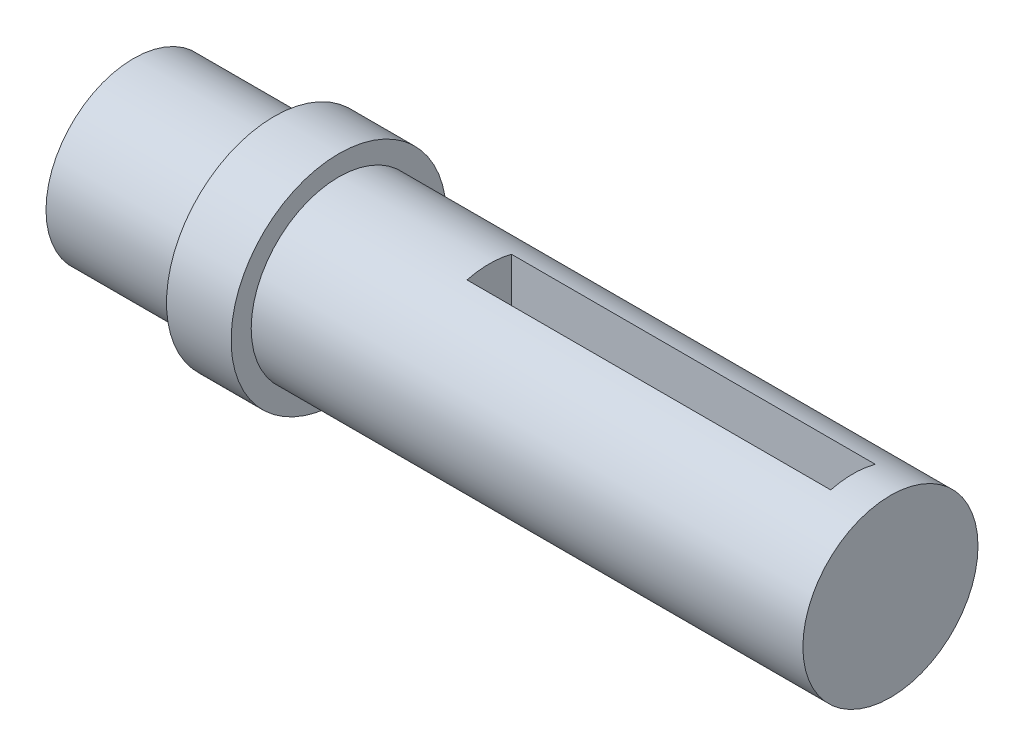
ISO-10303-21;
HEADER;
FILE_DESCRIPTION(('STEP AP214'),'2;1');
FILE_NAME('part.step','',(''),(''),'','','');
FILE_SCHEMA(('AUTOMOTIVE_DESIGN { 1 0 10303 214 1 1 1 1 }'));
ENDSEC;
DATA;
#1=APPLICATION_CONTEXT('core data for automotive mechanical design processes');
#2=APPLICATION_PROTOCOL_DEFINITION('international standard','automotive_design',2000,#1);
#3=PRODUCT_CONTEXT('',#1,'mechanical');
#4=PRODUCT('Part','Part','',(#3));
#5=PRODUCT_RELATED_PRODUCT_CATEGORY('part','',(#4));
#6=PRODUCT_DEFINITION_FORMATION('','',#4);
#7=PRODUCT_DEFINITION_CONTEXT('part definition',#1,'design');
#8=PRODUCT_DEFINITION('design','',#6,#7);
#9=PRODUCT_DEFINITION_SHAPE('','',#8);
#10=(LENGTH_UNIT() NAMED_UNIT(*) SI_UNIT(.MILLI.,.METRE.));
#11=(NAMED_UNIT(*) PLANE_ANGLE_UNIT() SI_UNIT($,.RADIAN.));
#12=(NAMED_UNIT(*) SI_UNIT($,.STERADIAN.) SOLID_ANGLE_UNIT());
#13=UNCERTAINTY_MEASURE_WITH_UNIT(LENGTH_MEASURE(1.E-05),#10,'distance_accuracy_value','');
#14=(GEOMETRIC_REPRESENTATION_CONTEXT(3) GLOBAL_UNCERTAINTY_ASSIGNED_CONTEXT((#13)) GLOBAL_UNIT_ASSIGNED_CONTEXT((#10,
#11,#12)) REPRESENTATION_CONTEXT('',''));
#15=CARTESIAN_POINT('',(0.,0.,0.));
#16=DIRECTION('',(0.,0.,1.));
#17=DIRECTION('',(1.,0.,0.));
#18=AXIS2_PLACEMENT_3D('',#15,#16,#17);
#19=CARTESIAN_POINT('',(161.48,0.,0.));
#20=DIRECTION('',(-1.,0.,0.));
#21=DIRECTION('',(0.,-1.,0.));
#22=AXIS2_PLACEMENT_3D('',#19,#20,#21);
#23=PLANE('',#22);
#24=CARTESIAN_POINT('',(161.48,0.,0.));
#25=DIRECTION('',(-1.,0.,0.));
#26=DIRECTION('',(0.,-1.,0.));
#27=AXIS2_PLACEMENT_3D('',#24,#25,#26);
#28=CIRCLE('',#27,18.68);
#29=CARTESIAN_POINT('',(161.48,-18.68,0.));
#30=VERTEX_POINT('',#29);
#31=EDGE_CURVE('E131',#30,#30,#28,.T.);
#32=ORIENTED_EDGE('',*,*,#31,.F.);
#33=EDGE_LOOP('',(#32));
#34=FACE_BOUND('',#33,.T.);
#35=ADVANCED_FACE('F57',(#34),#23,.F.);
#36=CARTESIAN_POINT('',(0.,0.,0.));
#37=DIRECTION('',(-1.,0.,0.));
#38=DIRECTION('',(0.,-1.,0.));
#39=AXIS2_PLACEMENT_3D('',#36,#37,#38);
#40=CYLINDRICAL_SURFACE('',#39,18.68);
#41=DIRECTION('',(-1.,0.,0.));
#42=VECTOR('',#41,1.);
#43=CARTESIAN_POINT('',(0.,18.0673012649925,4.74500000000001));
#44=LINE('',#43,#42);
#45=CARTESIAN_POINT('',(153.49,18.0673012649925,4.74499999999999));
#46=VERTEX_POINT('',#45);
#47=CARTESIAN_POINT('',(75.89,18.0673012649925,4.74500000000001));
#48=VERTEX_POINT('',#47);
#49=EDGE_CURVE('E97',#46,#48,#44,.T.);
#50=ORIENTED_EDGE('',*,*,#49,.T.);
#51=CARTESIAN_POINT('',(75.89,0.,0.));
#52=DIRECTION('',(-1.,0.,0.));
#53=DIRECTION('',(0.,0.,1.));
#54=AXIS2_PLACEMENT_3D('',#51,#52,#53);
#55=CIRCLE('',#54,18.68);
#56=CARTESIAN_POINT('',(75.89,18.0673012649925,-4.745));
#57=VERTEX_POINT('',#56);
#58=EDGE_CURVE('E13',#48,#57,#55,.T.);
#59=ORIENTED_EDGE('',*,*,#58,.T.);
#60=DIRECTION('',(-1.,0.,0.));
#61=VECTOR('',#60,1.);
#62=CARTESIAN_POINT('',(0.,18.0673012649925,-4.74499999999999));
#63=LINE('',#62,#61);
#64=CARTESIAN_POINT('',(153.49,18.0673012649925,-4.74500000000001));
#65=VERTEX_POINT('',#64);
#66=EDGE_CURVE('E60',#57,#65,#63,.F.);
#67=ORIENTED_EDGE('',*,*,#66,.T.);
#68=CARTESIAN_POINT('',(153.49,0.,0.));
#69=DIRECTION('',(1.,0.,0.));
#70=DIRECTION('',(0.,0.,-1.));
#71=AXIS2_PLACEMENT_3D('',#68,#69,#70);
#72=CIRCLE('',#71,18.68);
#73=EDGE_CURVE('E102',#65,#46,#72,.T.);
#74=ORIENTED_EDGE('',*,*,#73,.T.);
#75=EDGE_LOOP('',(#50,#59,#67,#74));
#76=FACE_BOUND('',#75,.T.);
#77=DIRECTION('',(-1.,0.,0.));
#78=VECTOR('',#77,1.);
#79=CARTESIAN_POINT('',(0.,-18.0673012649925,-4.74499999999999));
#80=LINE('',#79,#78);
#81=CARTESIAN_POINT('',(153.49,-18.0673012649925,-4.74500000000001));
#82=VERTEX_POINT('',#81);
#83=CARTESIAN_POINT('',(75.89,-18.0673012649925,-4.745));
#84=VERTEX_POINT('',#83);
#85=EDGE_CURVE('E124',#82,#84,#80,.T.);
#86=ORIENTED_EDGE('',*,*,#85,.T.);
#87=CARTESIAN_POINT('',(75.89,-18.0673012649925,4.745));
#88=VERTEX_POINT('',#87);
#89=EDGE_CURVE('E67',#84,#88,#55,.T.);
#90=ORIENTED_EDGE('',*,*,#89,.T.);
#91=DIRECTION('',(-1.,0.,0.));
#92=VECTOR('',#91,1.);
#93=CARTESIAN_POINT('',(0.,-18.0673012649925,4.74500000000001));
#94=LINE('',#93,#92);
#95=CARTESIAN_POINT('',(153.49,-18.0673012649925,4.74500000000001));
#96=VERTEX_POINT('',#95);
#97=EDGE_CURVE('E125',#88,#96,#94,.F.);
#98=ORIENTED_EDGE('',*,*,#97,.T.);
#99=EDGE_CURVE('E108',#96,#82,#72,.T.);
#100=ORIENTED_EDGE('',*,*,#99,.T.);
#101=EDGE_LOOP('',(#86,#90,#98,#100));
#102=FACE_BOUND('',#101,.T.);
#103=CARTESIAN_POINT('',(43.78,0.,0.));
#104=DIRECTION('',(-1.,0.,0.));
#105=DIRECTION('',(0.,-1.,0.));
#106=AXIS2_PLACEMENT_3D('',#103,#104,#105);
#107=CIRCLE('',#106,18.68);
#108=CARTESIAN_POINT('',(43.78,-18.68,0.));
#109=VERTEX_POINT('',#108);
#110=EDGE_CURVE('E137',#109,#109,#107,.T.);
#111=ORIENTED_EDGE('',*,*,#110,.F.);
#112=EDGE_LOOP('',(#111));
#113=FACE_BOUND('',#112,.T.);
#114=ORIENTED_EDGE('',*,*,#31,.T.);
#115=EDGE_LOOP('',(#114));
#116=FACE_BOUND('',#115,.T.);
#117=ADVANCED_FACE('F114',(#76,#102,#113,#116),#40,.T.);
#118=CARTESIAN_POINT('',(43.78,18.68,0.));
#119=DIRECTION('',(-1.,0.,0.));
#120=DIRECTION('',(0.,-1.,0.));
#121=AXIS2_PLACEMENT_3D('',#118,#119,#120);
#122=PLANE('',#121);
#123=CARTESIAN_POINT('',(43.78,0.,0.));
#124=DIRECTION('',(-1.,0.,0.));
#125=DIRECTION('',(0.,-1.,0.));
#126=AXIS2_PLACEMENT_3D('',#123,#124,#125);
#127=CIRCLE('',#126,22.97);
#128=CARTESIAN_POINT('',(43.78,-22.97,0.));
#129=VERTEX_POINT('',#128);
#130=EDGE_CURVE('E143',#129,#129,#127,.T.);
#131=ORIENTED_EDGE('',*,*,#130,.F.);
#132=EDGE_LOOP('',(#131));
#133=FACE_BOUND('',#132,.T.);
#134=ORIENTED_EDGE('',*,*,#110,.T.);
#135=EDGE_LOOP('',(#134));
#136=FACE_BOUND('',#135,.T.);
#137=ADVANCED_FACE('F204',(#133,#136),#122,.F.);
#138=CARTESIAN_POINT('',(0.,0.,0.));
#139=DIRECTION('',(-1.,0.,0.));
#140=DIRECTION('',(0.,-1.,0.));
#141=AXIS2_PLACEMENT_3D('',#138,#139,#140);
#142=CYLINDRICAL_SURFACE('',#141,22.97);
#143=CARTESIAN_POINT('',(30.,0.,0.));
#144=DIRECTION('',(-1.,0.,0.));
#145=DIRECTION('',(0.,-1.,0.));
#146=AXIS2_PLACEMENT_3D('',#143,#144,#145);
#147=CIRCLE('',#146,22.97);
#148=CARTESIAN_POINT('',(30.,-22.97,0.));
#149=VERTEX_POINT('',#148);
#150=EDGE_CURVE('E147',#149,#149,#147,.T.);
#151=ORIENTED_EDGE('',*,*,#150,.F.);
#152=EDGE_LOOP('',(#151));
#153=FACE_BOUND('',#152,.T.);
#154=ORIENTED_EDGE('',*,*,#130,.T.);
#155=EDGE_LOOP('',(#154));
#156=FACE_BOUND('',#155,.T.);
#157=ADVANCED_FACE('F224',(#153,#156),#142,.T.);
#158=CARTESIAN_POINT('',(30.,22.97,0.));
#159=DIRECTION('',(1.,0.,0.));
#160=DIRECTION('',(0.,1.,0.));
#161=AXIS2_PLACEMENT_3D('',#158,#159,#160);
#162=PLANE('',#161);
#163=CARTESIAN_POINT('',(30.,0.,0.));
#164=DIRECTION('',(-1.,0.,0.));
#165=DIRECTION('',(0.,-1.,0.));
#166=AXIS2_PLACEMENT_3D('',#163,#164,#165);
#167=CIRCLE('',#166,18.68);
#168=CARTESIAN_POINT('',(30.,-18.68,0.));
#169=VERTEX_POINT('',#168);
#170=EDGE_CURVE('E151',#169,#169,#167,.T.);
#171=ORIENTED_EDGE('',*,*,#170,.F.);
#172=EDGE_LOOP('',(#171));
#173=FACE_BOUND('',#172,.T.);
#174=ORIENTED_EDGE('',*,*,#150,.T.);
#175=EDGE_LOOP('',(#174));
#176=FACE_BOUND('',#175,.T.);
#177=ADVANCED_FACE('F232',(#173,#176),#162,.F.);
#178=CARTESIAN_POINT('',(0.,0.,0.));
#179=DIRECTION('',(-1.,0.,0.));
#180=DIRECTION('',(0.,-1.,0.));
#181=AXIS2_PLACEMENT_3D('',#178,#179,#180);
#182=CYLINDRICAL_SURFACE('',#181,18.68);
#183=CARTESIAN_POINT('',(0.,0.,0.));
#184=DIRECTION('',(-1.,0.,0.));
#185=DIRECTION('',(0.,-1.,0.));
#186=AXIS2_PLACEMENT_3D('',#183,#184,#185);
#187=CIRCLE('',#186,18.68);
#188=CARTESIAN_POINT('',(0.,-18.68,0.));
#189=VERTEX_POINT('',#188);
#190=EDGE_CURVE('E155',#189,#189,#187,.T.);
#191=ORIENTED_EDGE('',*,*,#190,.F.);
#192=EDGE_LOOP('',(#191));
#193=FACE_BOUND('',#192,.T.);
#194=ORIENTED_EDGE('',*,*,#170,.T.);
#195=EDGE_LOOP('',(#194));
#196=FACE_BOUND('',#195,.T.);
#197=ADVANCED_FACE('F240',(#193,#196),#182,.T.);
#198=CARTESIAN_POINT('',(0.,18.68,0.));
#199=DIRECTION('',(1.,0.,0.));
#200=DIRECTION('',(0.,1.,0.));
#201=AXIS2_PLACEMENT_3D('',#198,#199,#200);
#202=PLANE('',#201);
#203=ORIENTED_EDGE('',*,*,#190,.T.);
#204=EDGE_LOOP('',(#203));
#205=FACE_BOUND('',#204,.T.);
#206=ADVANCED_FACE('F248',(#205),#202,.F.);
#207=CARTESIAN_POINT('',(75.89,-22.97,4.745));
#208=DIRECTION('',(-1.,0.,0.));
#209=DIRECTION('',(0.,0.,1.));
#210=AXIS2_PLACEMENT_3D('',#207,#208,#209);
#211=PLANE('',#210);
#212=DIRECTION('',(0.,1.,0.));
#213=VECTOR('',#212,1.);
#214=CARTESIAN_POINT('',(75.89,-22.97,4.745));
#215=LINE('',#214,#213);
#216=EDGE_CURVE('E74',#88,#48,#215,.T.);
#217=ORIENTED_EDGE('',*,*,#216,.F.);
#218=ORIENTED_EDGE('',*,*,#89,.F.);
#219=DIRECTION('',(0.,1.,0.));
#220=VECTOR('',#219,1.);
#221=CARTESIAN_POINT('',(75.89,-22.97,-4.745));
#222=LINE('',#221,#220);
#223=EDGE_CURVE('E159',#84,#57,#222,.T.);
#224=ORIENTED_EDGE('',*,*,#223,.T.);
#225=ORIENTED_EDGE('',*,*,#58,.F.);
#226=EDGE_LOOP('',(#217,#218,#224,#225));
#227=FACE_BOUND('',#226,.T.);
#228=ADVANCED_FACE('F170',(#227),#211,.F.);
#229=CARTESIAN_POINT('',(153.49,-22.97,-4.74500000000001));
#230=DIRECTION('',(0.,0.,-1.));
#231=DIRECTION('',(-1.,0.,0.));
#232=AXIS2_PLACEMENT_3D('',#229,#230,#231);
#233=PLANE('',#232);
#234=DIRECTION('',(0.,1.,0.));
#235=VECTOR('',#234,1.);
#236=CARTESIAN_POINT('',(153.49,-22.97,-4.74500000000001));
#237=LINE('',#236,#235);
#238=EDGE_CURVE('E111',#82,#65,#237,.T.);
#239=ORIENTED_EDGE('',*,*,#238,.T.);
#240=ORIENTED_EDGE('',*,*,#66,.F.);
#241=ORIENTED_EDGE('',*,*,#223,.F.);
#242=ORIENTED_EDGE('',*,*,#85,.F.);
#243=EDGE_LOOP('',(#239,#240,#241,#242));
#244=FACE_BOUND('',#243,.T.);
#245=ADVANCED_FACE('F172',(#244),#233,.F.);
#246=CARTESIAN_POINT('',(153.49,-22.97,4.74499999999999));
#247=DIRECTION('',(1.,0.,0.));
#248=DIRECTION('',(0.,0.,-1.));
#249=AXIS2_PLACEMENT_3D('',#246,#247,#248);
#250=PLANE('',#249);
#251=ORIENTED_EDGE('',*,*,#238,.F.);
#252=ORIENTED_EDGE('',*,*,#99,.F.);
#253=DIRECTION('',(0.,1.,0.));
#254=VECTOR('',#253,1.);
#255=CARTESIAN_POINT('',(153.49,-22.97,4.74499999999999));
#256=LINE('',#255,#254);
#257=EDGE_CURVE('E79',#96,#46,#256,.T.);
#258=ORIENTED_EDGE('',*,*,#257,.T.);
#259=ORIENTED_EDGE('',*,*,#73,.F.);
#260=EDGE_LOOP('',(#251,#252,#258,#259));
#261=FACE_BOUND('',#260,.T.);
#262=ADVANCED_FACE('F105',(#261),#250,.F.);
#263=CARTESIAN_POINT('',(153.49,-22.97,4.74499999999999));
#264=DIRECTION('',(0.,0.,1.));
#265=DIRECTION('',(1.,0.,0.));
#266=AXIS2_PLACEMENT_3D('',#263,#264,#265);
#267=PLANE('',#266);
#268=ORIENTED_EDGE('',*,*,#257,.F.);
#269=ORIENTED_EDGE('',*,*,#97,.F.);
#270=ORIENTED_EDGE('',*,*,#216,.T.);
#271=ORIENTED_EDGE('',*,*,#49,.F.);
#272=EDGE_LOOP('',(#268,#269,#270,#271));
#273=FACE_BOUND('',#272,.T.);
#274=ADVANCED_FACE('F98',(#273),#267,.F.);
#275=CLOSED_SHELL('',(#35,#117,#137,#157,#177,#197,#206,#228,#245,#262,#274));
#276=MANIFOLD_SOLID_BREP('B2',#275);
#277=ADVANCED_BREP_SHAPE_REPRESENTATION('',(#18,#276),#14);
#278=SHAPE_DEFINITION_REPRESENTATION(#9,#277);
ENDSEC;
END-ISO-10303-21;
